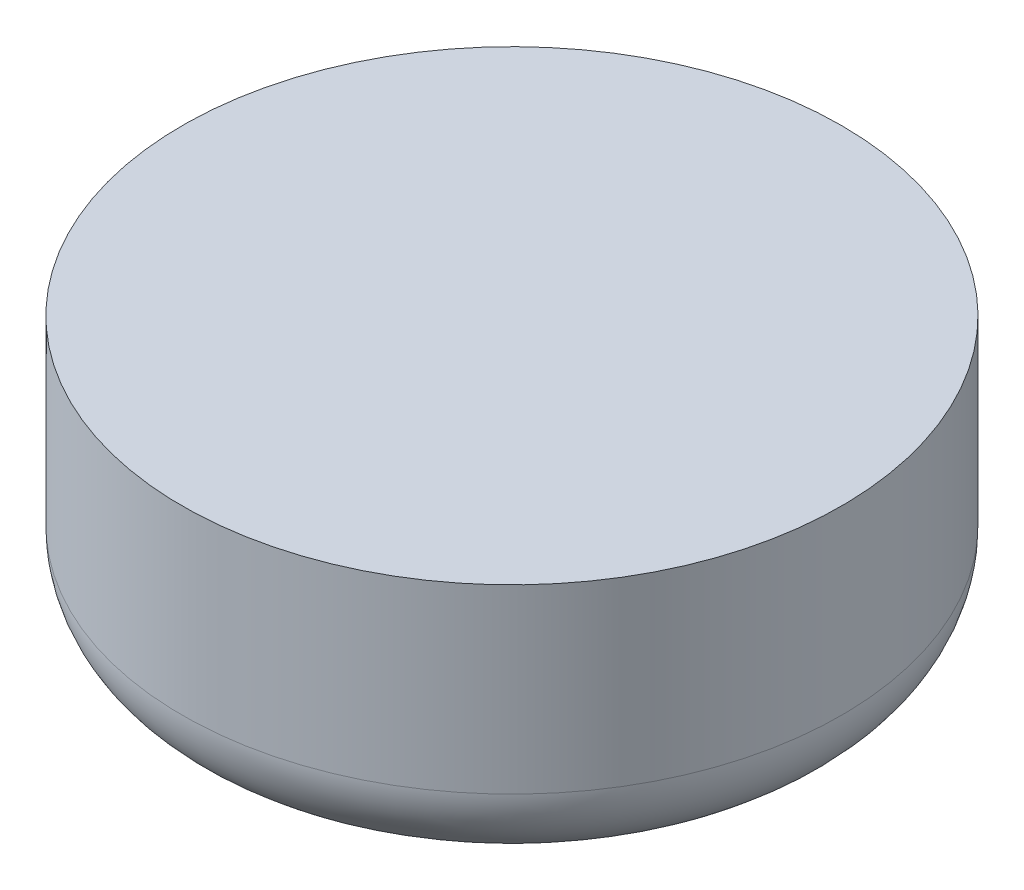
ISO-10303-21;
HEADER;
FILE_DESCRIPTION(('STEP AP214'),'2;1');
FILE_NAME('part.step','',(''),(''),'','','');
FILE_SCHEMA(('AUTOMOTIVE_DESIGN { 1 0 10303 214 1 1 1 1 }'));
ENDSEC;
DATA;
#1=APPLICATION_CONTEXT('core data for automotive mechanical design processes');
#2=APPLICATION_PROTOCOL_DEFINITION('international standard','automotive_design',2000,#1);
#3=PRODUCT_CONTEXT('',#1,'mechanical');
#4=PRODUCT('Part','Part','',(#3));
#5=PRODUCT_RELATED_PRODUCT_CATEGORY('part','',(#4));
#6=PRODUCT_DEFINITION_FORMATION('','',#4);
#7=PRODUCT_DEFINITION_CONTEXT('part definition',#1,'design');
#8=PRODUCT_DEFINITION('design','',#6,#7);
#9=PRODUCT_DEFINITION_SHAPE('','',#8);
#10=(LENGTH_UNIT() NAMED_UNIT(*) SI_UNIT(.MILLI.,.METRE.));
#11=(NAMED_UNIT(*) PLANE_ANGLE_UNIT() SI_UNIT($,.RADIAN.));
#12=(NAMED_UNIT(*) SI_UNIT($,.STERADIAN.) SOLID_ANGLE_UNIT());
#13=UNCERTAINTY_MEASURE_WITH_UNIT(LENGTH_MEASURE(1.E-05),#10,'distance_accuracy_value','');
#14=(GEOMETRIC_REPRESENTATION_CONTEXT(3) GLOBAL_UNCERTAINTY_ASSIGNED_CONTEXT((#13)) GLOBAL_UNIT_ASSIGNED_CONTEXT((#10,
#11,#12)) REPRESENTATION_CONTEXT('',''));
#15=CARTESIAN_POINT('',(0.,0.,0.));
#16=DIRECTION('',(0.,0.,1.));
#17=DIRECTION('',(1.,0.,0.));
#18=AXIS2_PLACEMENT_3D('',#15,#16,#17);
#19=CARTESIAN_POINT('',(7.14275765640867,-3.302,-8.18741843976961));
#20=DIRECTION('',(1.,0.,0.));
#21=DIRECTION('',(0.,1.,0.));
#22=AXIS2_PLACEMENT_3D('',#19,#20,#21);
#23=PLANE('',#22);
#24=DIRECTION('',(0.,0.,1.));
#25=VECTOR('',#24,1.);
#26=CARTESIAN_POINT('',(7.14275765666267,-4.572000000254,-11.4894184399389));
#27=LINE('',#26,#25);
#28=CARTESIAN_POINT('',(7.142757656578,-4.57200000016933,-11.4894184399389));
#29=VERTEX_POINT('',#28);
#30=CARTESIAN_POINT('',(7.142757656578,-4.57200000016933,-10.2194184399389));
#31=VERTEX_POINT('',#30);
#32=EDGE_CURVE('E121',#29,#31,#27,.T.);
#33=ORIENTED_EDGE('',*,*,#32,.T.);
#34=DIRECTION('',(0.,-1.,0.));
#35=VECTOR('',#34,1.);
#36=CARTESIAN_POINT('',(7.14275765666267,-3.30200000016933,-10.2194184400236));
#37=LINE('',#36,#35);
#38=CARTESIAN_POINT('',(7.142757656578,-3.30200000016933,-10.2194184399389));
#39=VERTEX_POINT('',#38);
#40=EDGE_CURVE('E109',#39,#31,#37,.T.);
#41=ORIENTED_EDGE('',*,*,#40,.F.);
#42=DIRECTION('',(0.,0.,1.));
#43=VECTOR('',#42,1.);
#44=CARTESIAN_POINT('',(7.14275765666267,-3.302000000254,-11.4894184399389));
#45=LINE('',#44,#43);
#46=CARTESIAN_POINT('',(7.142757656578,-3.30200000016933,-11.4894184399389));
#47=VERTEX_POINT('',#46);
#48=EDGE_CURVE('E120',#47,#39,#45,.T.);
#49=ORIENTED_EDGE('',*,*,#48,.F.);
#50=DIRECTION('',(0.,-1.,0.));
#51=VECTOR('',#50,1.);
#52=CARTESIAN_POINT('',(7.14275765666267,-3.30200000016933,-11.4894184400236));
#53=LINE('',#52,#51);
#54=EDGE_CURVE('E136',#47,#29,#53,.T.);
#55=ORIENTED_EDGE('',*,*,#54,.T.);
#56=EDGE_LOOP('',(#33,#41,#49,#55));
#57=FACE_BOUND('',#56,.T.);
#58=ADVANCED_FACE('F17',(#57),#23,.F.);
#59=CARTESIAN_POINT('',(6.76175765640867,-4.572,-9.83841843976961));
#60=DIRECTION('',(0.,-1.,0.));
#61=DIRECTION('',(0.,0.,-1.));
#62=AXIS2_PLACEMENT_3D('',#59,#60,#61);
#63=PLANE('',#62);
#64=DIRECTION('',(0.,0.,1.));
#65=VECTOR('',#64,1.);
#66=CARTESIAN_POINT('',(7.14275765666267,-4.572000000254,-9.45741843993894));
#67=LINE('',#66,#65);
#68=CARTESIAN_POINT('',(7.142757656578,-4.57200000016933,-9.45741843993894));
#69=VERTEX_POINT('',#68);
#70=CARTESIAN_POINT('',(7.14275765640867,-4.572,-8.18741843976961));
#71=VERTEX_POINT('',#70);
#72=EDGE_CURVE('E153',#69,#71,#67,.T.);
#73=ORIENTED_EDGE('',*,*,#72,.F.);
#74=DIRECTION('',(-1.,0.,0.));
#75=VECTOR('',#74,1.);
#76=CARTESIAN_POINT('',(8.412757656578,-4.572000000254,-9.45741844002361));
#77=LINE('',#76,#75);
#78=CARTESIAN_POINT('',(8.412757656578,-4.57200000016933,-9.45741843993894));
#79=VERTEX_POINT('',#78);
#80=EDGE_CURVE('E159',#79,#69,#77,.T.);
#81=ORIENTED_EDGE('',*,*,#80,.F.);
#82=DIRECTION('',(0.,0.,1.));
#83=VECTOR('',#82,1.);
#84=CARTESIAN_POINT('',(8.41275765666267,-4.572000000254,-10.2194184399389));
#85=LINE('',#84,#83);
#86=CARTESIAN_POINT('',(8.412757656578,-4.57200000016933,-10.2194184399389));
#87=VERTEX_POINT('',#86);
#88=EDGE_CURVE('E131',#87,#79,#85,.T.);
#89=ORIENTED_EDGE('',*,*,#88,.F.);
#90=DIRECTION('',(1.,0.,0.));
#91=VECTOR('',#90,1.);
#92=CARTESIAN_POINT('',(7.142757656578,-4.572000000254,-10.2194184400236));
#93=LINE('',#92,#91);
#94=EDGE_CURVE('E113',#31,#87,#93,.T.);
#95=ORIENTED_EDGE('',*,*,#94,.F.);
#96=ORIENTED_EDGE('',*,*,#32,.F.);
#97=DIRECTION('',(1.,0.,0.));
#98=VECTOR('',#97,1.);
#99=CARTESIAN_POINT('',(6.380757656578,-4.572000000254,-11.4894184400236));
#100=LINE('',#99,#98);
#101=CARTESIAN_POINT('',(6.380757656578,-4.57200000016933,-11.4894184399389));
#102=VERTEX_POINT('',#101);
#103=EDGE_CURVE('E133',#102,#29,#100,.T.);
#104=ORIENTED_EDGE('',*,*,#103,.F.);
#105=DIRECTION('',(0.,0.,-1.));
#106=VECTOR('',#105,1.);
#107=CARTESIAN_POINT('',(6.38075765666267,-4.572000000254,-10.2194184399389));
#108=LINE('',#107,#106);
#109=CARTESIAN_POINT('',(6.380757656578,-4.57200000016933,-10.2194184399389));
#110=VERTEX_POINT('',#109);
#111=EDGE_CURVE('E174',#110,#102,#108,.T.);
#112=ORIENTED_EDGE('',*,*,#111,.F.);
#113=DIRECTION('',(1.,0.,0.));
#114=VECTOR('',#113,1.);
#115=CARTESIAN_POINT('',(5.11075765640867,-4.572000000254,-10.2194184400236));
#116=LINE('',#115,#114);
#117=CARTESIAN_POINT('',(5.11075765640867,-4.572,-10.2194184397696));
#118=VERTEX_POINT('',#117);
#119=EDGE_CURVE('E179',#118,#110,#116,.T.);
#120=ORIENTED_EDGE('',*,*,#119,.F.);
#121=DIRECTION('',(0.,0.,-1.));
#122=VECTOR('',#121,1.);
#123=CARTESIAN_POINT('',(5.11075765666267,-4.572000000254,-9.45741843976961));
#124=LINE('',#123,#122);
#125=CARTESIAN_POINT('',(5.11075765640867,-4.572,-9.45741843976961));
#126=VERTEX_POINT('',#125);
#127=EDGE_CURVE('E184',#126,#118,#124,.T.);
#128=ORIENTED_EDGE('',*,*,#127,.F.);
#129=DIRECTION('',(-1.,0.,0.));
#130=VECTOR('',#129,1.);
#131=CARTESIAN_POINT('',(6.38075765640867,-4.572000000254,-9.45741844002361));
#132=LINE('',#131,#130);
#133=CARTESIAN_POINT('',(6.38075765640867,-4.572,-9.45741843976961));
#134=VERTEX_POINT('',#133);
#135=EDGE_CURVE('E189',#134,#126,#132,.T.);
#136=ORIENTED_EDGE('',*,*,#135,.F.);
#137=DIRECTION('',(0.,0.,-1.));
#138=VECTOR('',#137,1.);
#139=CARTESIAN_POINT('',(6.38075765666267,-4.572000000254,-8.18741843976961));
#140=LINE('',#139,#138);
#141=CARTESIAN_POINT('',(6.38075765640867,-4.572,-8.18741843976961));
#142=VERTEX_POINT('',#141);
#143=EDGE_CURVE('E194',#142,#134,#140,.T.);
#144=ORIENTED_EDGE('',*,*,#143,.F.);
#145=DIRECTION('',(-1.,0.,0.));
#146=VECTOR('',#145,1.);
#147=CARTESIAN_POINT('',(7.14275765640867,-4.572000000254,-8.18741844002361));
#148=LINE('',#147,#146);
#149=EDGE_CURVE('E199',#71,#142,#148,.T.);
#150=ORIENTED_EDGE('',*,*,#149,.F.);
#151=EDGE_LOOP('',(#73,#81,#89,#95,#96,#104,#112,#120,#128,#136,#144,#150));
#152=FACE_BOUND('',#151,.T.);
#153=CARTESIAN_POINT('',(6.76175765640867,-4.572,-9.83841843976961));
#154=DIRECTION('',(0.,-1.,0.));
#155=DIRECTION('',(1.33333064606371E-10,0.,-1.));
#156=AXIS2_PLACEMENT_3D('',#153,#154,#155);
#157=CIRCLE('',#156,1.905);
#158=CARTESIAN_POINT('',(6.76175765666267,-4.572,-11.7434184397696));
#159=VERTEX_POINT('',#158);
#160=EDGE_CURVE('E204',#159,#159,#157,.T.);
#161=ORIENTED_EDGE('',*,*,#160,.T.);
#162=EDGE_LOOP('',(#161));
#163=FACE_BOUND('',#162,.T.);
#164=ADVANCED_FACE('F127',(#152,#163),#63,.T.);
#165=CARTESIAN_POINT('',(6.38075765640867,-3.302,-10.2194184397696));
#166=DIRECTION('',(0.,0.,-1.));
#167=DIRECTION('',(0.,-1.,0.));
#168=AXIS2_PLACEMENT_3D('',#165,#166,#167);
#169=PLANE('',#168);
#170=ORIENTED_EDGE('',*,*,#94,.T.);
#171=DIRECTION('',(0.,-1.,0.));
#172=VECTOR('',#171,1.);
#173=CARTESIAN_POINT('',(8.41275765666267,-3.30200000016933,-10.2194184400236));
#174=LINE('',#173,#172);
#175=CARTESIAN_POINT('',(8.412757656578,-3.30200000016933,-10.2194184399389));
#176=VERTEX_POINT('',#175);
#177=EDGE_CURVE('E210',#176,#87,#174,.T.);
#178=ORIENTED_EDGE('',*,*,#177,.F.);
#179=DIRECTION('',(1.,0.,0.));
#180=VECTOR('',#179,1.);
#181=CARTESIAN_POINT('',(7.142757656578,-3.302000000254,-10.2194184400236));
#182=LINE('',#181,#180);
#183=EDGE_CURVE('E115',#39,#176,#182,.T.);
#184=ORIENTED_EDGE('',*,*,#183,.F.);
#185=ORIENTED_EDGE('',*,*,#40,.T.);
#186=EDGE_LOOP('',(#170,#178,#184,#185));
#187=FACE_BOUND('',#186,.T.);
#188=ADVANCED_FACE('F111',(#187),#169,.F.);
#189=CARTESIAN_POINT('',(0.,-3.302,0.));
#190=DIRECTION('',(0.,1.,0.));
#191=DIRECTION('',(1.,0.,0.));
#192=AXIS2_PLACEMENT_3D('',#189,#190,#191);
#193=PLANE('',#192);
#194=DIRECTION('',(0.,0.,1.));
#195=VECTOR('',#194,1.);
#196=CARTESIAN_POINT('',(7.14275765666267,-3.302000000254,-9.45741843993894));
#197=LINE('',#196,#195);
#198=CARTESIAN_POINT('',(7.142757656578,-3.30200000016933,-9.45741843993894));
#199=VERTEX_POINT('',#198);
#200=CARTESIAN_POINT('',(7.14275765640867,-3.302,-8.18741843976961));
#201=VERTEX_POINT('',#200);
#202=EDGE_CURVE('E217',#199,#201,#197,.T.);
#203=ORIENTED_EDGE('',*,*,#202,.T.);
#204=DIRECTION('',(-1.,0.,0.));
#205=VECTOR('',#204,1.);
#206=CARTESIAN_POINT('',(7.14275765640867,-3.302000000254,-8.18741844002361));
#207=LINE('',#206,#205);
#208=CARTESIAN_POINT('',(6.38075765640867,-3.302,-8.18741843976961));
#209=VERTEX_POINT('',#208);
#210=EDGE_CURVE('E223',#201,#209,#207,.T.);
#211=ORIENTED_EDGE('',*,*,#210,.T.);
#212=DIRECTION('',(0.,0.,-1.));
#213=VECTOR('',#212,1.);
#214=CARTESIAN_POINT('',(6.38075765666267,-3.302000000254,-8.18741843976961));
#215=LINE('',#214,#213);
#216=CARTESIAN_POINT('',(6.38075765640867,-3.302,-9.45741843976961));
#217=VERTEX_POINT('',#216);
#218=EDGE_CURVE('E229',#209,#217,#215,.T.);
#219=ORIENTED_EDGE('',*,*,#218,.T.);
#220=DIRECTION('',(-1.,0.,0.));
#221=VECTOR('',#220,1.);
#222=CARTESIAN_POINT('',(6.38075765640867,-3.302000000254,-9.45741844002361));
#223=LINE('',#222,#221);
#224=CARTESIAN_POINT('',(5.11075765640867,-3.302,-9.45741843976961));
#225=VERTEX_POINT('',#224);
#226=EDGE_CURVE('E235',#217,#225,#223,.T.);
#227=ORIENTED_EDGE('',*,*,#226,.T.);
#228=DIRECTION('',(0.,0.,-1.));
#229=VECTOR('',#228,1.);
#230=CARTESIAN_POINT('',(5.11075765666267,-3.302000000254,-9.45741843976961));
#231=LINE('',#230,#229);
#232=CARTESIAN_POINT('',(5.11075765640867,-3.302,-10.2194184397696));
#233=VERTEX_POINT('',#232);
#234=EDGE_CURVE('E241',#225,#233,#231,.T.);
#235=ORIENTED_EDGE('',*,*,#234,.T.);
#236=DIRECTION('',(1.,0.,0.));
#237=VECTOR('',#236,1.);
#238=CARTESIAN_POINT('',(5.11075765640867,-3.302000000254,-10.2194184400236));
#239=LINE('',#238,#237);
#240=CARTESIAN_POINT('',(6.380757656578,-3.30200000016933,-10.2194184399389));
#241=VERTEX_POINT('',#240);
#242=EDGE_CURVE('E247',#233,#241,#239,.T.);
#243=ORIENTED_EDGE('',*,*,#242,.T.);
#244=DIRECTION('',(0.,0.,-1.));
#245=VECTOR('',#244,1.);
#246=CARTESIAN_POINT('',(6.38075765666267,-3.302000000254,-10.2194184399389));
#247=LINE('',#246,#245);
#248=CARTESIAN_POINT('',(6.380757656578,-3.30200000016933,-11.4894184399389));
#249=VERTEX_POINT('',#248);
#250=EDGE_CURVE('E253',#241,#249,#247,.T.);
#251=ORIENTED_EDGE('',*,*,#250,.T.);
#252=DIRECTION('',(1.,0.,0.));
#253=VECTOR('',#252,1.);
#254=CARTESIAN_POINT('',(6.380757656578,-3.302000000254,-11.4894184400236));
#255=LINE('',#254,#253);
#256=EDGE_CURVE('E259',#249,#47,#255,.T.);
#257=ORIENTED_EDGE('',*,*,#256,.T.);
#258=ORIENTED_EDGE('',*,*,#48,.T.);
#259=ORIENTED_EDGE('',*,*,#183,.T.);
#260=DIRECTION('',(0.,0.,1.));
#261=VECTOR('',#260,1.);
#262=CARTESIAN_POINT('',(8.41275765666267,-3.302000000254,-10.2194184399389));
#263=LINE('',#262,#261);
#264=CARTESIAN_POINT('',(8.412757656578,-3.30200000016933,-9.45741843993894));
#265=VERTEX_POINT('',#264);
#266=EDGE_CURVE('E265',#176,#265,#263,.T.);
#267=ORIENTED_EDGE('',*,*,#266,.T.);
#268=DIRECTION('',(-1.,0.,0.));
#269=VECTOR('',#268,1.);
#270=CARTESIAN_POINT('',(8.412757656578,-3.302000000254,-9.45741844002361));
#271=LINE('',#270,#269);
#272=EDGE_CURVE('E270',#265,#199,#271,.T.);
#273=ORIENTED_EDGE('',*,*,#272,.T.);
#274=EDGE_LOOP('',(#203,#211,#219,#227,#235,#243,#251,#257,#258,#259,#267,#273));
#275=FACE_BOUND('',#274,.T.);
#276=ADVANCED_FACE('F366',(#275),#193,.F.);
#277=CARTESIAN_POINT('',(7.14275765640867,-3.302,-11.4894184397696));
#278=DIRECTION('',(0.,0.,-1.));
#279=DIRECTION('',(0.,-1.,0.));
#280=AXIS2_PLACEMENT_3D('',#277,#278,#279);
#281=PLANE('',#280);
#282=ORIENTED_EDGE('',*,*,#103,.T.);
#283=ORIENTED_EDGE('',*,*,#54,.F.);
#284=ORIENTED_EDGE('',*,*,#256,.F.);
#285=DIRECTION('',(0.,-1.,0.));
#286=VECTOR('',#285,1.);
#287=CARTESIAN_POINT('',(6.38075765666267,-3.30200000016933,-11.4894184400236));
#288=LINE('',#287,#286);
#289=EDGE_CURVE('E275',#249,#102,#288,.T.);
#290=ORIENTED_EDGE('',*,*,#289,.T.);
#291=EDGE_LOOP('',(#282,#283,#284,#290));
#292=FACE_BOUND('',#291,.T.);
#293=ADVANCED_FACE('F357',(#292),#281,.F.);
#294=ORIENTED_EDGE('',*,*,#72,.T.);
#295=DIRECTION('',(0.,-1.,0.));
#296=VECTOR('',#295,1.);
#297=CARTESIAN_POINT('',(7.14275765666267,-3.302,-8.18741844002361));
#298=LINE('',#297,#296);
#299=EDGE_CURVE('E281',#201,#71,#298,.T.);
#300=ORIENTED_EDGE('',*,*,#299,.F.);
#301=ORIENTED_EDGE('',*,*,#202,.F.);
#302=DIRECTION('',(0.,-1.,0.));
#303=VECTOR('',#302,1.);
#304=CARTESIAN_POINT('',(7.14275765666267,-3.30200000016933,-9.45741844002361));
#305=LINE('',#304,#303);
#306=EDGE_CURVE('E33',#199,#69,#305,.T.);
#307=ORIENTED_EDGE('',*,*,#306,.T.);
#308=EDGE_LOOP('',(#294,#300,#301,#307));
#309=FACE_BOUND('',#308,.T.);
#310=ADVANCED_FACE('F350',(#309),#23,.F.);
#311=CARTESIAN_POINT('',(6.38075765640867,-3.302,-9.45741843976961));
#312=DIRECTION('',(0.,0.,1.));
#313=DIRECTION('',(1.,0.,0.));
#314=AXIS2_PLACEMENT_3D('',#311,#312,#313);
#315=PLANE('',#314);
#316=ORIENTED_EDGE('',*,*,#80,.T.);
#317=ORIENTED_EDGE('',*,*,#306,.F.);
#318=ORIENTED_EDGE('',*,*,#272,.F.);
#319=DIRECTION('',(0.,-1.,0.));
#320=VECTOR('',#319,1.);
#321=CARTESIAN_POINT('',(8.41275765666267,-3.30200000016933,-9.45741844002361));
#322=LINE('',#321,#320);
#323=EDGE_CURVE('E41',#265,#79,#322,.T.);
#324=ORIENTED_EDGE('',*,*,#323,.T.);
#325=EDGE_LOOP('',(#316,#317,#318,#324));
#326=FACE_BOUND('',#325,.T.);
#327=ADVANCED_FACE('F356',(#326),#315,.F.);
#328=CARTESIAN_POINT('',(8.41275765640867,-3.302,-9.45741843976961));
#329=DIRECTION('',(1.,0.,0.));
#330=DIRECTION('',(0.,1.,0.));
#331=AXIS2_PLACEMENT_3D('',#328,#329,#330);
#332=PLANE('',#331);
#333=ORIENTED_EDGE('',*,*,#88,.T.);
#334=ORIENTED_EDGE('',*,*,#323,.F.);
#335=ORIENTED_EDGE('',*,*,#266,.F.);
#336=ORIENTED_EDGE('',*,*,#177,.T.);
#337=EDGE_LOOP('',(#333,#334,#335,#336));
#338=FACE_BOUND('',#337,.T.);
#339=ADVANCED_FACE('F363',(#338),#332,.F.);
#340=CARTESIAN_POINT('',(6.38075765640867,-3.302,-8.18741843976961));
#341=DIRECTION('',(-1.,0.,0.));
#342=DIRECTION('',(0.,0.,1.));
#343=AXIS2_PLACEMENT_3D('',#340,#341,#342);
#344=PLANE('',#343);
#345=ORIENTED_EDGE('',*,*,#111,.T.);
#346=ORIENTED_EDGE('',*,*,#289,.F.);
#347=ORIENTED_EDGE('',*,*,#250,.F.);
#348=DIRECTION('',(0.,-1.,0.));
#349=VECTOR('',#348,1.);
#350=CARTESIAN_POINT('',(6.38075765666267,-3.30200000016933,-10.2194184400236));
#351=LINE('',#350,#349);
#352=EDGE_CURVE('E294',#241,#110,#351,.T.);
#353=ORIENTED_EDGE('',*,*,#352,.T.);
#354=EDGE_LOOP('',(#345,#346,#347,#353));
#355=FACE_BOUND('',#354,.T.);
#356=ADVANCED_FACE('F390',(#355),#344,.F.);
#357=ORIENTED_EDGE('',*,*,#119,.T.);
#358=ORIENTED_EDGE('',*,*,#352,.F.);
#359=ORIENTED_EDGE('',*,*,#242,.F.);
#360=DIRECTION('',(0.,-1.,0.));
#361=VECTOR('',#360,1.);
#362=CARTESIAN_POINT('',(5.11075765666267,-3.302,-10.2194184400236));
#363=LINE('',#362,#361);
#364=EDGE_CURVE('E300',#233,#118,#363,.T.);
#365=ORIENTED_EDGE('',*,*,#364,.T.);
#366=EDGE_LOOP('',(#357,#358,#359,#365));
#367=FACE_BOUND('',#366,.T.);
#368=ADVANCED_FACE('F386',(#367),#169,.F.);
#369=CARTESIAN_POINT('',(5.11075765640867,-3.302,-9.45741843976961));
#370=DIRECTION('',(-1.,0.,0.));
#371=DIRECTION('',(0.,0.,1.));
#372=AXIS2_PLACEMENT_3D('',#369,#370,#371);
#373=PLANE('',#372);
#374=ORIENTED_EDGE('',*,*,#127,.T.);
#375=ORIENTED_EDGE('',*,*,#364,.F.);
#376=ORIENTED_EDGE('',*,*,#234,.F.);
#377=DIRECTION('',(0.,-1.,0.));
#378=VECTOR('',#377,1.);
#379=CARTESIAN_POINT('',(5.11075765666267,-3.302,-9.45741844002361));
#380=LINE('',#379,#378);
#381=EDGE_CURVE('E306',#225,#126,#380,.T.);
#382=ORIENTED_EDGE('',*,*,#381,.T.);
#383=EDGE_LOOP('',(#374,#375,#376,#382));
#384=FACE_BOUND('',#383,.T.);
#385=ADVANCED_FACE('F382',(#384),#373,.F.);
#386=ORIENTED_EDGE('',*,*,#135,.T.);
#387=ORIENTED_EDGE('',*,*,#381,.F.);
#388=ORIENTED_EDGE('',*,*,#226,.F.);
#389=DIRECTION('',(0.,-1.,0.));
#390=VECTOR('',#389,1.);
#391=CARTESIAN_POINT('',(6.38075765666267,-3.302,-9.45741844002361));
#392=LINE('',#391,#390);
#393=EDGE_CURVE('E312',#217,#134,#392,.T.);
#394=ORIENTED_EDGE('',*,*,#393,.T.);
#395=EDGE_LOOP('',(#386,#387,#388,#394));
#396=FACE_BOUND('',#395,.T.);
#397=ADVANCED_FACE('F365',(#396),#315,.F.);
#398=ORIENTED_EDGE('',*,*,#143,.T.);
#399=ORIENTED_EDGE('',*,*,#393,.F.);
#400=ORIENTED_EDGE('',*,*,#218,.F.);
#401=DIRECTION('',(0.,-1.,0.));
#402=VECTOR('',#401,1.);
#403=CARTESIAN_POINT('',(6.38075765666267,-3.302,-8.18741844002361));
#404=LINE('',#403,#402);
#405=EDGE_CURVE('E318',#209,#142,#404,.T.);
#406=ORIENTED_EDGE('',*,*,#405,.T.);
#407=EDGE_LOOP('',(#398,#399,#400,#406));
#408=FACE_BOUND('',#407,.T.);
#409=ADVANCED_FACE('F344',(#408),#344,.F.);
#410=CARTESIAN_POINT('',(7.14275765640867,-3.302,-8.18741843976961));
#411=DIRECTION('',(0.,0.,1.));
#412=DIRECTION('',(1.,0.,0.));
#413=AXIS2_PLACEMENT_3D('',#410,#411,#412);
#414=PLANE('',#413);
#415=ORIENTED_EDGE('',*,*,#149,.T.);
#416=ORIENTED_EDGE('',*,*,#405,.F.);
#417=ORIENTED_EDGE('',*,*,#210,.F.);
#418=ORIENTED_EDGE('',*,*,#299,.T.);
#419=EDGE_LOOP('',(#415,#416,#417,#418));
#420=FACE_BOUND('',#419,.T.);
#421=ADVANCED_FACE('F335',(#420),#414,.F.);
#422=CARTESIAN_POINT('',(6.76175765640867,-3.937,-9.83841843976961));
#423=DIRECTION('',(0.,-1.,0.));
#424=DIRECTION('',(0.,0.,-1.));
#425=AXIS2_PLACEMENT_3D('',#422,#423,#424);
#426=TOROIDAL_SURFACE('',#425,1.905,0.635);
#427=ORIENTED_EDGE('',*,*,#160,.F.);
#428=EDGE_LOOP('',(#427));
#429=FACE_BOUND('',#428,.T.);
#430=CARTESIAN_POINT('',(6.76175765640867,-3.937000000254,-9.83841843976961));
#431=DIRECTION('',(0.,1.,0.));
#432=DIRECTION('',(9.99997984581113E-11,0.,-1.));
#433=AXIS2_PLACEMENT_3D('',#430,#431,#432);
#434=CIRCLE('',#433,2.540000000254);
#435=CARTESIAN_POINT('',(6.76175765666267,-3.937000000254,-12.3784184400236));
#436=VERTEX_POINT('',#435);
#437=EDGE_CURVE('E26',#436,#436,#434,.T.);
#438=ORIENTED_EDGE('',*,*,#437,.F.);
#439=EDGE_LOOP('',(#438));
#440=FACE_BOUND('',#439,.T.);
#441=ADVANCED_FACE('F333',(#429,#440),#426,.T.);
#442=CARTESIAN_POINT('',(6.76175765640867,-4.572,-9.83841843976961));
#443=DIRECTION('',(0.,-1.,0.));
#444=DIRECTION('',(0.,0.,1.));
#445=AXIS2_PLACEMENT_3D('',#442,#443,#444);
#446=CYLINDRICAL_SURFACE('',#445,2.54);
#447=CARTESIAN_POINT('',(6.76175765640867,-2.54,-9.83841843976961));
#448=DIRECTION('',(0.,-1.,0.));
#449=DIRECTION('',(9.99997984581113E-11,0.,-1.));
#450=AXIS2_PLACEMENT_3D('',#447,#448,#449);
#451=CIRCLE('',#450,2.54);
#452=CARTESIAN_POINT('',(6.76175765666267,-2.54,-12.3784184397696));
#453=VERTEX_POINT('',#452);
#454=EDGE_CURVE('E11',#453,#453,#451,.T.);
#455=ORIENTED_EDGE('',*,*,#454,.T.);
#456=EDGE_LOOP('',(#455));
#457=FACE_BOUND('',#456,.T.);
#458=ORIENTED_EDGE('',*,*,#437,.T.);
#459=EDGE_LOOP('',(#458));
#460=FACE_BOUND('',#459,.T.);
#461=ADVANCED_FACE('F331',(#457,#460),#446,.T.);
#462=CARTESIAN_POINT('',(6.76175765640867,-2.54,-9.83841843976961));
#463=DIRECTION('',(0.,-1.,0.));
#464=DIRECTION('',(0.,0.,-1.));
#465=AXIS2_PLACEMENT_3D('',#462,#463,#464);
#466=PLANE('',#465);
#467=ORIENTED_EDGE('',*,*,#454,.F.);
#468=EDGE_LOOP('',(#467));
#469=FACE_BOUND('',#468,.T.);
#470=ADVANCED_FACE('F19',(#469),#466,.F.);
#471=CLOSED_SHELL('',(#58,#164,#188,#276,#293,#310,#327,#339,#356,#368,#385,#397,#409,#421,#441,
#461,#470));
#472=MANIFOLD_SOLID_BREP('B1',#471);
#473=ADVANCED_BREP_SHAPE_REPRESENTATION('',(#18,#472),#14);
#474=SHAPE_DEFINITION_REPRESENTATION(#9,#473);
ENDSEC;
END-ISO-10303-21;
